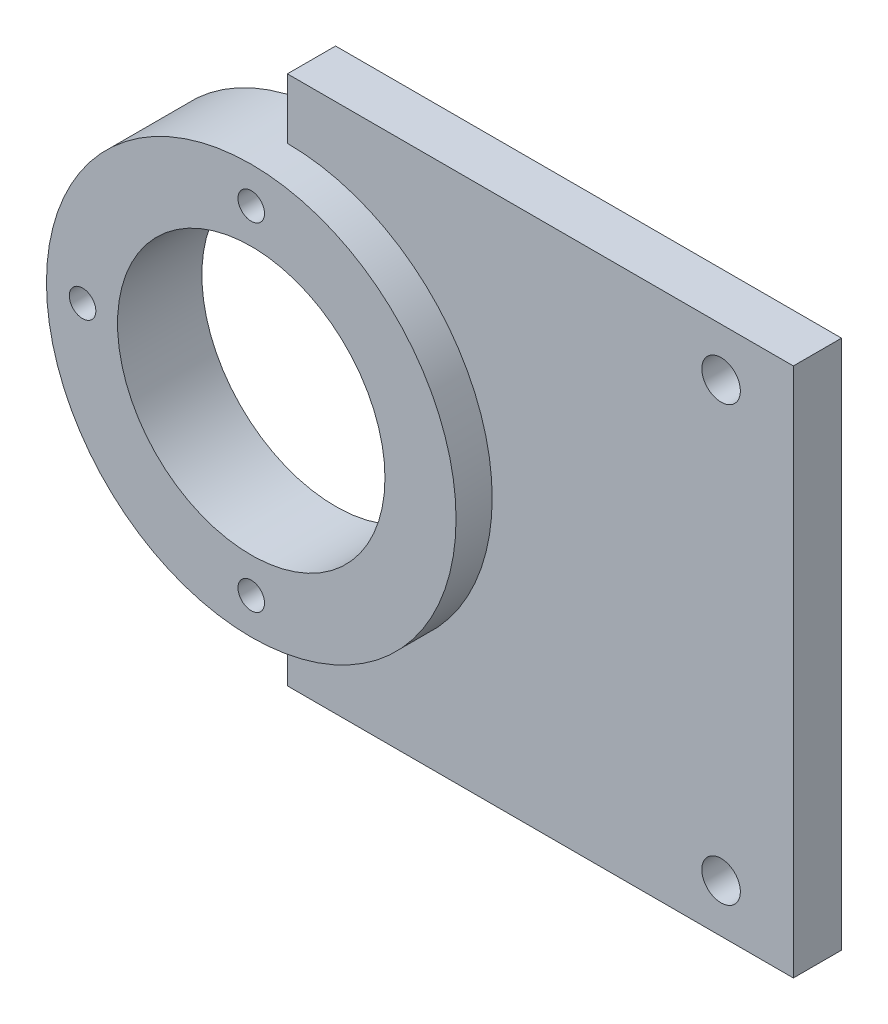
ISO-10303-21;
HEADER;
FILE_DESCRIPTION(('STEP AP214'),'2;1');
FILE_NAME('part.step','',(''),(''),'','','');
FILE_SCHEMA(('AUTOMOTIVE_DESIGN { 1 0 10303 214 1 1 1 1 }'));
ENDSEC;
DATA;
#1=APPLICATION_CONTEXT('core data for automotive mechanical design processes');
#2=APPLICATION_PROTOCOL_DEFINITION('international standard','automotive_design',2000,#1);
#3=PRODUCT_CONTEXT('',#1,'mechanical');
#4=PRODUCT('Part','Part','',(#3));
#5=PRODUCT_RELATED_PRODUCT_CATEGORY('part','',(#4));
#6=PRODUCT_DEFINITION_FORMATION('','',#4);
#7=PRODUCT_DEFINITION_CONTEXT('part definition',#1,'design');
#8=PRODUCT_DEFINITION('design','',#6,#7);
#9=PRODUCT_DEFINITION_SHAPE('','',#8);
#10=(LENGTH_UNIT() NAMED_UNIT(*) SI_UNIT(.MILLI.,.METRE.));
#11=(NAMED_UNIT(*) PLANE_ANGLE_UNIT() SI_UNIT($,.RADIAN.));
#12=(NAMED_UNIT(*) SI_UNIT($,.STERADIAN.) SOLID_ANGLE_UNIT());
#13=UNCERTAINTY_MEASURE_WITH_UNIT(LENGTH_MEASURE(1.E-05),#10,'distance_accuracy_value','');
#14=(GEOMETRIC_REPRESENTATION_CONTEXT(3) GLOBAL_UNCERTAINTY_ASSIGNED_CONTEXT((#13)) GLOBAL_UNIT_ASSIGNED_CONTEXT((#10,
#11,#12)) REPRESENTATION_CONTEXT('',''));
#15=CARTESIAN_POINT('',(0.,0.,0.));
#16=DIRECTION('',(0.,0.,1.));
#17=DIRECTION('',(1.,0.,0.));
#18=AXIS2_PLACEMENT_3D('',#15,#16,#17);
#19=CARTESIAN_POINT('',(0.,0.,7.));
#20=DIRECTION('',(0.,0.,-1.));
#21=DIRECTION('',(-1.,0.,0.));
#22=AXIS2_PLACEMENT_3D('',#19,#20,#21);
#23=CYLINDRICAL_SURFACE('',#22,17.);
#24=CARTESIAN_POINT('',(0.,0.,7.));
#25=DIRECTION('',(0.,0.,1.));
#26=DIRECTION('',(1.,0.,0.));
#27=AXIS2_PLACEMENT_3D('',#24,#25,#26);
#28=CIRCLE('',#27,17.);
#29=CARTESIAN_POINT('',(17.,0.,7.));
#30=VERTEX_POINT('',#29);
#31=EDGE_CURVE('E11',#30,#30,#28,.T.);
#32=ORIENTED_EDGE('',*,*,#31,.F.);
#33=EDGE_LOOP('',(#32));
#34=FACE_BOUND('',#33,.T.);
#35=DIRECTION('',(0.,0.,-1.));
#36=VECTOR('',#35,1.);
#37=CARTESIAN_POINT('',(0.,-17.,7.));
#38=LINE('',#37,#36);
#39=CARTESIAN_POINT('',(0.,-17.,4.));
#40=VERTEX_POINT('',#39);
#41=CARTESIAN_POINT('',(0.,-17.,0.));
#42=VERTEX_POINT('',#41);
#43=EDGE_CURVE('E133',#40,#42,#38,.T.);
#44=ORIENTED_EDGE('',*,*,#43,.F.);
#45=CARTESIAN_POINT('',(0.,0.,4.));
#46=DIRECTION('',(0.,0.,-1.));
#47=DIRECTION('',(-1.,0.,0.));
#48=AXIS2_PLACEMENT_3D('',#45,#46,#47);
#49=CIRCLE('',#48,17.);
#50=CARTESIAN_POINT('',(0.,17.,4.));
#51=VERTEX_POINT('',#50);
#52=EDGE_CURVE('E65',#51,#40,#49,.T.);
#53=ORIENTED_EDGE('',*,*,#52,.F.);
#54=DIRECTION('',(0.,0.,-1.));
#55=VECTOR('',#54,1.);
#56=CARTESIAN_POINT('',(0.,17.,7.));
#57=LINE('',#56,#55);
#58=CARTESIAN_POINT('',(0.,17.,0.));
#59=VERTEX_POINT('',#58);
#60=EDGE_CURVE('E130',#59,#51,#57,.F.);
#61=ORIENTED_EDGE('',*,*,#60,.F.);
#62=CARTESIAN_POINT('',(0.,0.,0.));
#63=DIRECTION('',(0.,0.,1.));
#64=DIRECTION('',(1.,0.,0.));
#65=AXIS2_PLACEMENT_3D('',#62,#63,#64);
#66=CIRCLE('',#65,17.);
#67=EDGE_CURVE('E53',#59,#42,#66,.T.);
#68=ORIENTED_EDGE('',*,*,#67,.T.);
#69=EDGE_LOOP('',(#44,#53,#61,#68));
#70=FACE_BOUND('',#69,.T.);
#71=ADVANCED_FACE('F44',(#34,#70),#23,.T.);
#72=CARTESIAN_POINT('',(0.,0.,7.));
#73=DIRECTION('',(0.,0.,-1.));
#74=DIRECTION('',(-1.,0.,0.));
#75=AXIS2_PLACEMENT_3D('',#72,#73,#74);
#76=CYLINDRICAL_SURFACE('',#75,11.1);
#77=CARTESIAN_POINT('',(0.,0.,0.));
#78=DIRECTION('',(0.,0.,1.));
#79=DIRECTION('',(1.,0.,0.));
#80=AXIS2_PLACEMENT_3D('',#77,#78,#79);
#81=CIRCLE('',#80,11.1);
#82=CARTESIAN_POINT('',(11.1,0.,0.));
#83=VERTEX_POINT('',#82);
#84=EDGE_CURVE('E138',#83,#83,#81,.T.);
#85=ORIENTED_EDGE('',*,*,#84,.F.);
#86=EDGE_LOOP('',(#85));
#87=FACE_BOUND('',#86,.T.);
#88=CARTESIAN_POINT('',(0.,0.,7.));
#89=DIRECTION('',(0.,0.,1.));
#90=DIRECTION('',(1.,0.,0.));
#91=AXIS2_PLACEMENT_3D('',#88,#89,#90);
#92=CIRCLE('',#91,11.1);
#93=CARTESIAN_POINT('',(11.1,0.,7.));
#94=VERTEX_POINT('',#93);
#95=EDGE_CURVE('E139',#94,#94,#92,.T.);
#96=ORIENTED_EDGE('',*,*,#95,.T.);
#97=EDGE_LOOP('',(#96));
#98=FACE_BOUND('',#97,.T.);
#99=ADVANCED_FACE('F247',(#87,#98),#76,.F.);
#100=CARTESIAN_POINT('',(0.,0.,7.));
#101=DIRECTION('',(0.,0.,1.));
#102=DIRECTION('',(1.,0.,0.));
#103=AXIS2_PLACEMENT_3D('',#100,#101,#102);
#104=PLANE('',#103);
#105=CARTESIAN_POINT('',(-14.,0.,7.));
#106=DIRECTION('',(0.,0.,1.));
#107=DIRECTION('',(1.,0.,0.));
#108=AXIS2_PLACEMENT_3D('',#105,#106,#107);
#109=CIRCLE('',#108,1.1);
#110=CARTESIAN_POINT('',(-15.1,0.,7.));
#111=VERTEX_POINT('',#110);
#112=EDGE_CURVE('E165',#111,#111,#109,.T.);
#113=ORIENTED_EDGE('',*,*,#112,.F.);
#114=EDGE_LOOP('',(#113));
#115=FACE_BOUND('',#114,.T.);
#116=CARTESIAN_POINT('',(0.,-14.,7.));
#117=DIRECTION('',(0.,0.,1.));
#118=DIRECTION('',(1.,0.,0.));
#119=AXIS2_PLACEMENT_3D('',#116,#117,#118);
#120=CIRCLE('',#119,1.1);
#121=CARTESIAN_POINT('',(-1.1,-14.,7.));
#122=VERTEX_POINT('',#121);
#123=EDGE_CURVE('E231',#122,#122,#120,.T.);
#124=ORIENTED_EDGE('',*,*,#123,.F.);
#125=EDGE_LOOP('',(#124));
#126=FACE_BOUND('',#125,.T.);
#127=CARTESIAN_POINT('',(0.,14.,7.));
#128=DIRECTION('',(0.,0.,1.));
#129=DIRECTION('',(1.,0.,0.));
#130=AXIS2_PLACEMENT_3D('',#127,#128,#129);
#131=CIRCLE('',#130,1.1);
#132=CARTESIAN_POINT('',(-1.1,14.,7.));
#133=VERTEX_POINT('',#132);
#134=EDGE_CURVE('E232',#133,#133,#131,.T.);
#135=ORIENTED_EDGE('',*,*,#134,.F.);
#136=EDGE_LOOP('',(#135));
#137=FACE_BOUND('',#136,.T.);
#138=ORIENTED_EDGE('',*,*,#31,.T.);
#139=EDGE_LOOP('',(#138));
#140=FACE_BOUND('',#139,.T.);
#141=ORIENTED_EDGE('',*,*,#95,.F.);
#142=EDGE_LOOP('',(#141));
#143=FACE_BOUND('',#142,.T.);
#144=ADVANCED_FACE('F177',(#115,#126,#137,#140,#143),#104,.T.);
#145=CARTESIAN_POINT('',(0.,0.,0.));
#146=DIRECTION('',(0.,0.,1.));
#147=DIRECTION('',(1.,0.,0.));
#148=AXIS2_PLACEMENT_3D('',#145,#146,#147);
#149=PLANE('',#148);
#150=CARTESIAN_POINT('',(-14.,0.,0.));
#151=DIRECTION('',(0.,0.,1.));
#152=DIRECTION('',(1.,0.,0.));
#153=AXIS2_PLACEMENT_3D('',#150,#151,#152);
#154=CIRCLE('',#153,1.1);
#155=CARTESIAN_POINT('',(-15.1,0.,0.));
#156=VERTEX_POINT('',#155);
#157=EDGE_CURVE('E48',#156,#156,#154,.F.);
#158=ORIENTED_EDGE('',*,*,#157,.F.);
#159=EDGE_LOOP('',(#158));
#160=FACE_BOUND('',#159,.T.);
#161=CARTESIAN_POINT('',(0.,-14.,0.));
#162=DIRECTION('',(0.,0.,1.));
#163=DIRECTION('',(1.,0.,0.));
#164=AXIS2_PLACEMENT_3D('',#161,#162,#163);
#165=CIRCLE('',#164,1.1);
#166=CARTESIAN_POINT('',(-1.1,-14.,0.));
#167=VERTEX_POINT('',#166);
#168=EDGE_CURVE('E161',#167,#167,#165,.F.);
#169=ORIENTED_EDGE('',*,*,#168,.F.);
#170=EDGE_LOOP('',(#169));
#171=FACE_BOUND('',#170,.T.);
#172=CARTESIAN_POINT('',(0.,14.,0.));
#173=DIRECTION('',(0.,0.,1.));
#174=DIRECTION('',(1.,0.,0.));
#175=AXIS2_PLACEMENT_3D('',#172,#173,#174);
#176=CIRCLE('',#175,1.1);
#177=CARTESIAN_POINT('',(-1.1,14.,0.));
#178=VERTEX_POINT('',#177);
#179=EDGE_CURVE('E158',#178,#178,#176,.F.);
#180=ORIENTED_EDGE('',*,*,#179,.F.);
#181=EDGE_LOOP('',(#180));
#182=FACE_BOUND('',#181,.T.);
#183=CARTESIAN_POINT('',(36.,-18.,0.));
#184=DIRECTION('',(0.,0.,1.));
#185=DIRECTION('',(1.,0.,0.));
#186=AXIS2_PLACEMENT_3D('',#183,#184,#185);
#187=CIRCLE('',#186,1.6);
#188=CARTESIAN_POINT('',(34.4,-18.,0.));
#189=VERTEX_POINT('',#188);
#190=EDGE_CURVE('E160',#189,#189,#187,.F.);
#191=ORIENTED_EDGE('',*,*,#190,.F.);
#192=EDGE_LOOP('',(#191));
#193=FACE_BOUND('',#192,.T.);
#194=CARTESIAN_POINT('',(36.,18.,0.));
#195=DIRECTION('',(0.,0.,1.));
#196=DIRECTION('',(1.,0.,0.));
#197=AXIS2_PLACEMENT_3D('',#194,#195,#196);
#198=CIRCLE('',#197,1.6);
#199=CARTESIAN_POINT('',(34.4,18.,0.));
#200=VERTEX_POINT('',#199);
#201=EDGE_CURVE('E155',#200,#200,#198,.F.);
#202=ORIENTED_EDGE('',*,*,#201,.F.);
#203=EDGE_LOOP('',(#202));
#204=FACE_BOUND('',#203,.T.);
#205=ORIENTED_EDGE('',*,*,#84,.T.);
#206=EDGE_LOOP('',(#205));
#207=FACE_BOUND('',#206,.T.);
#208=ORIENTED_EDGE('',*,*,#67,.F.);
#209=DIRECTION('',(0.,-1.,0.));
#210=VECTOR('',#209,1.);
#211=CARTESIAN_POINT('',(0.,-22.,0.));
#212=LINE('',#211,#210);
#213=CARTESIAN_POINT('',(0.,22.,0.));
#214=VERTEX_POINT('',#213);
#215=EDGE_CURVE('E192',#214,#59,#212,.T.);
#216=ORIENTED_EDGE('',*,*,#215,.F.);
#217=DIRECTION('',(-1.,0.,0.));
#218=VECTOR('',#217,1.);
#219=CARTESIAN_POINT('',(0.,22.,0.));
#220=LINE('',#219,#218);
#221=CARTESIAN_POINT('',(42.,22.,0.));
#222=VERTEX_POINT('',#221);
#223=EDGE_CURVE('E110',#222,#214,#220,.T.);
#224=ORIENTED_EDGE('',*,*,#223,.F.);
#225=DIRECTION('',(0.,1.,0.));
#226=VECTOR('',#225,1.);
#227=CARTESIAN_POINT('',(42.,-22.,0.));
#228=LINE('',#227,#226);
#229=CARTESIAN_POINT('',(42.,-22.,0.));
#230=VERTEX_POINT('',#229);
#231=EDGE_CURVE('E201',#230,#222,#228,.T.);
#232=ORIENTED_EDGE('',*,*,#231,.F.);
#233=DIRECTION('',(1.,0.,0.));
#234=VECTOR('',#233,1.);
#235=CARTESIAN_POINT('',(0.,-22.,0.));
#236=LINE('',#235,#234);
#237=CARTESIAN_POINT('',(0.,-22.,0.));
#238=VERTEX_POINT('',#237);
#239=EDGE_CURVE('E200',#238,#230,#236,.T.);
#240=ORIENTED_EDGE('',*,*,#239,.F.);
#241=EDGE_CURVE('E122',#42,#238,#212,.T.);
#242=ORIENTED_EDGE('',*,*,#241,.F.);
#243=EDGE_LOOP('',(#208,#216,#224,#232,#240,#242));
#244=FACE_BOUND('',#243,.T.);
#245=ADVANCED_FACE('F174',(#160,#171,#182,#193,#204,#207,#244),#149,.F.);
#246=CARTESIAN_POINT('',(0.,-22.,4.));
#247=DIRECTION('',(1.,0.,0.));
#248=DIRECTION('',(0.,0.,-1.));
#249=AXIS2_PLACEMENT_3D('',#246,#247,#248);
#250=PLANE('',#249);
#251=DIRECTION('',(0.,-1.,0.));
#252=VECTOR('',#251,1.);
#253=CARTESIAN_POINT('',(0.,-22.,4.));
#254=LINE('',#253,#252);
#255=CARTESIAN_POINT('',(0.,-22.,4.));
#256=VERTEX_POINT('',#255);
#257=EDGE_CURVE('E100',#40,#256,#254,.T.);
#258=ORIENTED_EDGE('',*,*,#257,.F.);
#259=ORIENTED_EDGE('',*,*,#43,.T.);
#260=ORIENTED_EDGE('',*,*,#241,.T.);
#261=DIRECTION('',(0.,0.,-1.));
#262=VECTOR('',#261,1.);
#263=CARTESIAN_POINT('',(0.,-22.,4.));
#264=LINE('',#263,#262);
#265=EDGE_CURVE('E115',#256,#238,#264,.T.);
#266=ORIENTED_EDGE('',*,*,#265,.F.);
#267=EDGE_LOOP('',(#258,#259,#260,#266));
#268=FACE_BOUND('',#267,.T.);
#269=ADVANCED_FACE('F116',(#268),#250,.F.);
#270=ORIENTED_EDGE('',*,*,#215,.T.);
#271=ORIENTED_EDGE('',*,*,#60,.T.);
#272=CARTESIAN_POINT('',(0.,22.,4.));
#273=VERTEX_POINT('',#272);
#274=EDGE_CURVE('E106',#273,#51,#254,.T.);
#275=ORIENTED_EDGE('',*,*,#274,.F.);
#276=DIRECTION('',(0.,0.,-1.));
#277=VECTOR('',#276,1.);
#278=CARTESIAN_POINT('',(0.,22.,4.));
#279=LINE('',#278,#277);
#280=EDGE_CURVE('E197',#273,#214,#279,.T.);
#281=ORIENTED_EDGE('',*,*,#280,.T.);
#282=EDGE_LOOP('',(#270,#271,#275,#281));
#283=FACE_BOUND('',#282,.T.);
#284=ADVANCED_FACE('F194',(#283),#250,.F.);
#285=CARTESIAN_POINT('',(0.,-22.,4.));
#286=DIRECTION('',(0.,1.,0.));
#287=DIRECTION('',(0.,0.,1.));
#288=AXIS2_PLACEMENT_3D('',#285,#286,#287);
#289=PLANE('',#288);
#290=ORIENTED_EDGE('',*,*,#239,.T.);
#291=DIRECTION('',(0.,0.,-1.));
#292=VECTOR('',#291,1.);
#293=CARTESIAN_POINT('',(42.,-22.,4.));
#294=LINE('',#293,#292);
#295=CARTESIAN_POINT('',(42.,-22.,4.));
#296=VERTEX_POINT('',#295);
#297=EDGE_CURVE('E111',#296,#230,#294,.T.);
#298=ORIENTED_EDGE('',*,*,#297,.F.);
#299=DIRECTION('',(1.,0.,0.));
#300=VECTOR('',#299,1.);
#301=CARTESIAN_POINT('',(0.,-22.,4.));
#302=LINE('',#301,#300);
#303=EDGE_CURVE('E101',#256,#296,#302,.T.);
#304=ORIENTED_EDGE('',*,*,#303,.F.);
#305=ORIENTED_EDGE('',*,*,#265,.T.);
#306=EDGE_LOOP('',(#290,#298,#304,#305));
#307=FACE_BOUND('',#306,.T.);
#308=ADVANCED_FACE('F112',(#307),#289,.F.);
#309=CARTESIAN_POINT('',(42.,-22.,4.));
#310=DIRECTION('',(-1.,0.,0.));
#311=DIRECTION('',(0.,0.,1.));
#312=AXIS2_PLACEMENT_3D('',#309,#310,#311);
#313=PLANE('',#312);
#314=ORIENTED_EDGE('',*,*,#231,.T.);
#315=DIRECTION('',(0.,0.,-1.));
#316=VECTOR('',#315,1.);
#317=CARTESIAN_POINT('',(42.,22.,4.));
#318=LINE('',#317,#316);
#319=CARTESIAN_POINT('',(42.,22.,4.));
#320=VERTEX_POINT('',#319);
#321=EDGE_CURVE('E129',#320,#222,#318,.T.);
#322=ORIENTED_EDGE('',*,*,#321,.F.);
#323=DIRECTION('',(0.,1.,0.));
#324=VECTOR('',#323,1.);
#325=CARTESIAN_POINT('',(42.,-22.,4.));
#326=LINE('',#325,#324);
#327=EDGE_CURVE('E120',#296,#320,#326,.T.);
#328=ORIENTED_EDGE('',*,*,#327,.F.);
#329=ORIENTED_EDGE('',*,*,#297,.T.);
#330=EDGE_LOOP('',(#314,#322,#328,#329));
#331=FACE_BOUND('',#330,.T.);
#332=ADVANCED_FACE('F225',(#331),#313,.F.);
#333=CARTESIAN_POINT('',(0.,22.,4.));
#334=DIRECTION('',(0.,-1.,0.));
#335=DIRECTION('',(0.,0.,-1.));
#336=AXIS2_PLACEMENT_3D('',#333,#334,#335);
#337=PLANE('',#336);
#338=ORIENTED_EDGE('',*,*,#223,.T.);
#339=ORIENTED_EDGE('',*,*,#280,.F.);
#340=DIRECTION('',(-1.,0.,0.));
#341=VECTOR('',#340,1.);
#342=CARTESIAN_POINT('',(0.,22.,4.));
#343=LINE('',#342,#341);
#344=EDGE_CURVE('E206',#320,#273,#343,.T.);
#345=ORIENTED_EDGE('',*,*,#344,.F.);
#346=ORIENTED_EDGE('',*,*,#321,.T.);
#347=EDGE_LOOP('',(#338,#339,#345,#346));
#348=FACE_BOUND('',#347,.T.);
#349=ADVANCED_FACE('F218',(#348),#337,.F.);
#350=CARTESIAN_POINT('',(0.,0.,4.));
#351=DIRECTION('',(0.,0.,-1.));
#352=DIRECTION('',(-1.,0.,0.));
#353=AXIS2_PLACEMENT_3D('',#350,#351,#352);
#354=PLANE('',#353);
#355=CARTESIAN_POINT('',(36.,-18.,4.));
#356=DIRECTION('',(0.,0.,-1.));
#357=DIRECTION('',(-1.,0.,0.));
#358=AXIS2_PLACEMENT_3D('',#355,#356,#357);
#359=CIRCLE('',#358,1.6);
#360=CARTESIAN_POINT('',(34.4,-18.,4.));
#361=VERTEX_POINT('',#360);
#362=EDGE_CURVE('E153',#361,#361,#359,.F.);
#363=ORIENTED_EDGE('',*,*,#362,.F.);
#364=EDGE_LOOP('',(#363));
#365=FACE_BOUND('',#364,.T.);
#366=CARTESIAN_POINT('',(36.,18.,4.));
#367=DIRECTION('',(0.,0.,-1.));
#368=DIRECTION('',(-1.,0.,0.));
#369=AXIS2_PLACEMENT_3D('',#366,#367,#368);
#370=CIRCLE('',#369,1.6);
#371=CARTESIAN_POINT('',(34.4,18.,4.));
#372=VERTEX_POINT('',#371);
#373=EDGE_CURVE('E146',#372,#372,#370,.F.);
#374=ORIENTED_EDGE('',*,*,#373,.F.);
#375=EDGE_LOOP('',(#374));
#376=FACE_BOUND('',#375,.T.);
#377=ORIENTED_EDGE('',*,*,#274,.T.);
#378=ORIENTED_EDGE('',*,*,#52,.T.);
#379=ORIENTED_EDGE('',*,*,#257,.T.);
#380=ORIENTED_EDGE('',*,*,#303,.T.);
#381=ORIENTED_EDGE('',*,*,#327,.T.);
#382=ORIENTED_EDGE('',*,*,#344,.T.);
#383=EDGE_LOOP('',(#377,#378,#379,#380,#381,#382));
#384=FACE_BOUND('',#383,.T.);
#385=ADVANCED_FACE('F99',(#365,#376,#384),#354,.F.);
#386=CARTESIAN_POINT('',(36.,18.,7.));
#387=DIRECTION('',(0.,0.,-1.));
#388=DIRECTION('',(-1.,0.,0.));
#389=AXIS2_PLACEMENT_3D('',#386,#387,#388);
#390=CYLINDRICAL_SURFACE('',#389,1.6);
#391=CARTESIAN_POINT('',(34.4,18.,4.));
#392=CARTESIAN_POINT('',(34.4,18.,3.95833333333333));
#393=CARTESIAN_POINT('',(34.4,18.,3.91666666666667));
#394=CARTESIAN_POINT('',(34.4,18.,3.83333333333333));
#395=CARTESIAN_POINT('',(34.4,18.,3.79166666666667));
#396=CARTESIAN_POINT('',(34.4,18.,3.70833333333333));
#397=CARTESIAN_POINT('',(34.4,18.,3.66666666666667));
#398=CARTESIAN_POINT('',(34.4,18.,3.58333333333333));
#399=CARTESIAN_POINT('',(34.4,18.,3.54166666666667));
#400=CARTESIAN_POINT('',(34.4,18.,3.45833333333333));
#401=CARTESIAN_POINT('',(34.4,18.,3.41666666666667));
#402=CARTESIAN_POINT('',(34.4,18.,3.33333333333333));
#403=CARTESIAN_POINT('',(34.4,18.,3.29166666666667));
#404=CARTESIAN_POINT('',(34.4,18.,3.20833333333333));
#405=CARTESIAN_POINT('',(34.4,18.,3.16666666666667));
#406=CARTESIAN_POINT('',(34.4,18.,3.08333333333333));
#407=CARTESIAN_POINT('',(34.4,18.,3.04166666666667));
#408=CARTESIAN_POINT('',(34.4,18.,2.95833333333333));
#409=CARTESIAN_POINT('',(34.4,18.,2.91666666666667));
#410=CARTESIAN_POINT('',(34.4,18.,2.83333333333333));
#411=CARTESIAN_POINT('',(34.4,18.,2.79166666666667));
#412=CARTESIAN_POINT('',(34.4,18.,2.70833333333333));
#413=CARTESIAN_POINT('',(34.4,18.,2.66666666666667));
#414=CARTESIAN_POINT('',(34.4,18.,2.58333333333333));
#415=CARTESIAN_POINT('',(34.4,18.,2.54166666666667));
#416=CARTESIAN_POINT('',(34.4,18.,2.45833333333333));
#417=CARTESIAN_POINT('',(34.4,18.,2.41666666666667));
#418=CARTESIAN_POINT('',(34.4,18.,2.33333333333333));
#419=CARTESIAN_POINT('',(34.4,18.,2.29166666666667));
#420=CARTESIAN_POINT('',(34.4,18.,2.20833333333333));
#421=CARTESIAN_POINT('',(34.4,18.,2.16666666666667));
#422=CARTESIAN_POINT('',(34.4,18.,2.08333333333333));
#423=CARTESIAN_POINT('',(34.4,18.,2.04166666666667));
#424=CARTESIAN_POINT('',(34.4,18.,1.95833333333333));
#425=CARTESIAN_POINT('',(34.4,18.,1.91666666666667));
#426=CARTESIAN_POINT('',(34.4,18.,1.83333333333333));
#427=CARTESIAN_POINT('',(34.4,18.,1.79166666666667));
#428=CARTESIAN_POINT('',(34.4,18.,1.70833333333333));
#429=CARTESIAN_POINT('',(34.4,18.,1.66666666666667));
#430=CARTESIAN_POINT('',(34.4,18.,1.58333333333333));
#431=CARTESIAN_POINT('',(34.4,18.,1.54166666666667));
#432=CARTESIAN_POINT('',(34.4,18.,1.45833333333333));
#433=CARTESIAN_POINT('',(34.4,18.,1.41666666666667));
#434=CARTESIAN_POINT('',(34.4,18.,1.33333333333333));
#435=CARTESIAN_POINT('',(34.4,18.,1.29166666666667));
#436=CARTESIAN_POINT('',(34.4,18.,1.20833333333333));
#437=CARTESIAN_POINT('',(34.4,18.,1.16666666666667));
#438=CARTESIAN_POINT('',(34.4,18.,1.08333333333333));
#439=CARTESIAN_POINT('',(34.4,18.,1.04166666666667));
#440=CARTESIAN_POINT('',(34.4,18.,0.958333333333333));
#441=CARTESIAN_POINT('',(34.4,18.,0.916666666666667));
#442=CARTESIAN_POINT('',(34.4,18.,0.833333333333333));
#443=CARTESIAN_POINT('',(34.4,18.,0.791666666666667));
#444=CARTESIAN_POINT('',(34.4,18.,0.708333333333333));
#445=CARTESIAN_POINT('',(34.4,18.,0.666666666666666));
#446=CARTESIAN_POINT('',(34.4,18.,0.583333333333333));
#447=CARTESIAN_POINT('',(34.4,18.,0.541666666666666));
#448=CARTESIAN_POINT('',(34.4,18.,0.458333333333333));
#449=CARTESIAN_POINT('',(34.4,18.,0.416666666666666));
#450=CARTESIAN_POINT('',(34.4,18.,0.333333333333333));
#451=CARTESIAN_POINT('',(34.4,18.,0.291666666666666));
#452=CARTESIAN_POINT('',(34.4,18.,0.208333333333333));
#453=CARTESIAN_POINT('',(34.4,18.,0.166666666666666));
#454=CARTESIAN_POINT('',(34.4,18.,0.0833333333333325));
#455=CARTESIAN_POINT('',(34.4,18.,0.0416666666666658));
#456=CARTESIAN_POINT('',(34.4,18.,0.));
#457=B_SPLINE_CURVE_WITH_KNOTS('',3,(#391,#392,#393,#394,#395,#396,#397,#398,#399,#400,#401,
#402,#403,#404,#405,#406,#407,#408,#409,#410,#411,#412,#413,#414,#415,#416,#417,#418,#419,#420,
#421,#422,#423,#424,#425,#426,#427,#428,#429,#430,#431,#432,#433,#434,#435,#436,#437,#438,#439,
#440,#441,#442,#443,#444,#445,#446,#447,#448,#449,#450,#451,#452,#453,#454,#455,#456),
.UNSPECIFIED.,.F.,.F.,(4,2,2,2,2,2,2,2,2,2,2,2,2,2,2,2,2,2,2,2,2,2,2,2,2,2,2,2,2,2,2,2,4),(0.,
0.125,0.25,0.375,0.5,0.625,0.75,0.875,1.,1.125,1.25,1.375,1.5,1.625,1.75,1.875,2.,2.125,2.25,
2.375,2.5,2.625,2.75,2.875,3.,3.125,3.25,3.375,3.5,3.625,3.75,3.875,4.),.UNSPECIFIED.);
#458=EDGE_CURVE('BSEAM273',#372,#200,#457,.T.);
#459=ORIENTED_EDGE('',*,*,#373,.T.);
#460=ORIENTED_EDGE('',*,*,#201,.T.);
#461=ORIENTED_EDGE('',*,*,#458,.T.);
#462=ORIENTED_EDGE('',*,*,#458,.F.);
#463=EDGE_LOOP('',(#459,#461,#460,#462));
#464=FACE_BOUND('',#463,.T.);
#465=ADVANCED_FACE('F273',(#464),#390,.F.);
#466=CARTESIAN_POINT('',(36.,-18.,7.));
#467=DIRECTION('',(0.,0.,-1.));
#468=DIRECTION('',(-1.,0.,0.));
#469=AXIS2_PLACEMENT_3D('',#466,#467,#468);
#470=CYLINDRICAL_SURFACE('',#469,1.6);
#471=CARTESIAN_POINT('',(34.4,-18.,4.));
#472=CARTESIAN_POINT('',(34.4,-18.,3.95833333333333));
#473=CARTESIAN_POINT('',(34.4,-18.,3.91666666666667));
#474=CARTESIAN_POINT('',(34.4,-18.,3.83333333333333));
#475=CARTESIAN_POINT('',(34.4,-18.,3.79166666666667));
#476=CARTESIAN_POINT('',(34.4,-18.,3.70833333333333));
#477=CARTESIAN_POINT('',(34.4,-18.,3.66666666666667));
#478=CARTESIAN_POINT('',(34.4,-18.,3.58333333333333));
#479=CARTESIAN_POINT('',(34.4,-18.,3.54166666666667));
#480=CARTESIAN_POINT('',(34.4,-18.,3.45833333333333));
#481=CARTESIAN_POINT('',(34.4,-18.,3.41666666666667));
#482=CARTESIAN_POINT('',(34.4,-18.,3.33333333333333));
#483=CARTESIAN_POINT('',(34.4,-18.,3.29166666666667));
#484=CARTESIAN_POINT('',(34.4,-18.,3.20833333333333));
#485=CARTESIAN_POINT('',(34.4,-18.,3.16666666666667));
#486=CARTESIAN_POINT('',(34.4,-18.,3.08333333333333));
#487=CARTESIAN_POINT('',(34.4,-18.,3.04166666666667));
#488=CARTESIAN_POINT('',(34.4,-18.,2.95833333333333));
#489=CARTESIAN_POINT('',(34.4,-18.,2.91666666666667));
#490=CARTESIAN_POINT('',(34.4,-18.,2.83333333333333));
#491=CARTESIAN_POINT('',(34.4,-18.,2.79166666666667));
#492=CARTESIAN_POINT('',(34.4,-18.,2.70833333333333));
#493=CARTESIAN_POINT('',(34.4,-18.,2.66666666666667));
#494=CARTESIAN_POINT('',(34.4,-18.,2.58333333333333));
#495=CARTESIAN_POINT('',(34.4,-18.,2.54166666666667));
#496=CARTESIAN_POINT('',(34.4,-18.,2.45833333333333));
#497=CARTESIAN_POINT('',(34.4,-18.,2.41666666666667));
#498=CARTESIAN_POINT('',(34.4,-18.,2.33333333333333));
#499=CARTESIAN_POINT('',(34.4,-18.,2.29166666666667));
#500=CARTESIAN_POINT('',(34.4,-18.,2.20833333333333));
#501=CARTESIAN_POINT('',(34.4,-18.,2.16666666666667));
#502=CARTESIAN_POINT('',(34.4,-18.,2.08333333333333));
#503=CARTESIAN_POINT('',(34.4,-18.,2.04166666666667));
#504=CARTESIAN_POINT('',(34.4,-18.,1.95833333333333));
#505=CARTESIAN_POINT('',(34.4,-18.,1.91666666666667));
#506=CARTESIAN_POINT('',(34.4,-18.,1.83333333333333));
#507=CARTESIAN_POINT('',(34.4,-18.,1.79166666666667));
#508=CARTESIAN_POINT('',(34.4,-18.,1.70833333333333));
#509=CARTESIAN_POINT('',(34.4,-18.,1.66666666666667));
#510=CARTESIAN_POINT('',(34.4,-18.,1.58333333333333));
#511=CARTESIAN_POINT('',(34.4,-18.,1.54166666666667));
#512=CARTESIAN_POINT('',(34.4,-18.,1.45833333333333));
#513=CARTESIAN_POINT('',(34.4,-18.,1.41666666666667));
#514=CARTESIAN_POINT('',(34.4,-18.,1.33333333333333));
#515=CARTESIAN_POINT('',(34.4,-18.,1.29166666666667));
#516=CARTESIAN_POINT('',(34.4,-18.,1.20833333333333));
#517=CARTESIAN_POINT('',(34.4,-18.,1.16666666666667));
#518=CARTESIAN_POINT('',(34.4,-18.,1.08333333333333));
#519=CARTESIAN_POINT('',(34.4,-18.,1.04166666666667));
#520=CARTESIAN_POINT('',(34.4,-18.,0.958333333333333));
#521=CARTESIAN_POINT('',(34.4,-18.,0.916666666666667));
#522=CARTESIAN_POINT('',(34.4,-18.,0.833333333333333));
#523=CARTESIAN_POINT('',(34.4,-18.,0.791666666666667));
#524=CARTESIAN_POINT('',(34.4,-18.,0.708333333333333));
#525=CARTESIAN_POINT('',(34.4,-18.,0.666666666666666));
#526=CARTESIAN_POINT('',(34.4,-18.,0.583333333333333));
#527=CARTESIAN_POINT('',(34.4,-18.,0.541666666666666));
#528=CARTESIAN_POINT('',(34.4,-18.,0.458333333333333));
#529=CARTESIAN_POINT('',(34.4,-18.,0.416666666666666));
#530=CARTESIAN_POINT('',(34.4,-18.,0.333333333333333));
#531=CARTESIAN_POINT('',(34.4,-18.,0.291666666666666));
#532=CARTESIAN_POINT('',(34.4,-18.,0.208333333333333));
#533=CARTESIAN_POINT('',(34.4,-18.,0.166666666666666));
#534=CARTESIAN_POINT('',(34.4,-18.,0.0833333333333325));
#535=CARTESIAN_POINT('',(34.4,-18.,0.0416666666666658));
#536=CARTESIAN_POINT('',(34.4,-18.,0.));
#537=B_SPLINE_CURVE_WITH_KNOTS('',3,(#471,#472,#473,#474,#475,#476,#477,#478,#479,#480,#481,
#482,#483,#484,#485,#486,#487,#488,#489,#490,#491,#492,#493,#494,#495,#496,#497,#498,#499,#500,
#501,#502,#503,#504,#505,#506,#507,#508,#509,#510,#511,#512,#513,#514,#515,#516,#517,#518,#519,
#520,#521,#522,#523,#524,#525,#526,#527,#528,#529,#530,#531,#532,#533,#534,#535,#536),
.UNSPECIFIED.,.F.,.F.,(4,2,2,2,2,2,2,2,2,2,2,2,2,2,2,2,2,2,2,2,2,2,2,2,2,2,2,2,2,2,2,2,4),(0.,
0.125,0.25,0.375,0.5,0.625,0.75,0.875,1.,1.125,1.25,1.375,1.5,1.625,1.75,1.875,2.,2.125,2.25,
2.375,2.5,2.625,2.75,2.875,3.,3.125,3.25,3.375,3.5,3.625,3.75,3.875,4.),.UNSPECIFIED.);
#538=EDGE_CURVE('BSEAM279',#361,#189,#537,.T.);
#539=ORIENTED_EDGE('',*,*,#362,.T.);
#540=ORIENTED_EDGE('',*,*,#190,.T.);
#541=ORIENTED_EDGE('',*,*,#538,.T.);
#542=ORIENTED_EDGE('',*,*,#538,.F.);
#543=EDGE_LOOP('',(#539,#541,#540,#542));
#544=FACE_BOUND('',#543,.T.);
#545=ADVANCED_FACE('F279',(#544),#470,.F.);
#546=CARTESIAN_POINT('',(0.,14.,7.));
#547=DIRECTION('',(0.,0.,-1.));
#548=DIRECTION('',(-1.,0.,0.));
#549=AXIS2_PLACEMENT_3D('',#546,#547,#548);
#550=CYLINDRICAL_SURFACE('',#549,1.1);
#551=CARTESIAN_POINT('',(-1.1,14.,7.));
#552=CARTESIAN_POINT('',(-1.1,14.,6.92708333333333));
#553=CARTESIAN_POINT('',(-1.1,14.,6.85416666666667));
#554=CARTESIAN_POINT('',(-1.1,14.,6.70833333333333));
#555=CARTESIAN_POINT('',(-1.1,14.,6.63541666666667));
#556=CARTESIAN_POINT('',(-1.1,14.,6.48958333333333));
#557=CARTESIAN_POINT('',(-1.1,14.,6.41666666666667));
#558=CARTESIAN_POINT('',(-1.1,14.,6.27083333333333));
#559=CARTESIAN_POINT('',(-1.1,14.,6.19791666666667));
#560=CARTESIAN_POINT('',(-1.1,14.,6.05208333333333));
#561=CARTESIAN_POINT('',(-1.1,14.,5.97916666666667));
#562=CARTESIAN_POINT('',(-1.1,14.,5.83333333333333));
#563=CARTESIAN_POINT('',(-1.1,14.,5.76041666666667));
#564=CARTESIAN_POINT('',(-1.1,14.,5.61458333333333));
#565=CARTESIAN_POINT('',(-1.1,14.,5.54166666666667));
#566=CARTESIAN_POINT('',(-1.1,14.,5.39583333333333));
#567=CARTESIAN_POINT('',(-1.1,14.,5.32291666666667));
#568=CARTESIAN_POINT('',(-1.1,14.,5.17708333333333));
#569=CARTESIAN_POINT('',(-1.1,14.,5.10416666666667));
#570=CARTESIAN_POINT('',(-1.1,14.,4.95833333333333));
#571=CARTESIAN_POINT('',(-1.1,14.,4.88541666666667));
#572=CARTESIAN_POINT('',(-1.1,14.,4.73958333333333));
#573=CARTESIAN_POINT('',(-1.1,14.,4.66666666666667));
#574=CARTESIAN_POINT('',(-1.1,14.,4.52083333333333));
#575=CARTESIAN_POINT('',(-1.1,14.,4.44791666666667));
#576=CARTESIAN_POINT('',(-1.1,14.,4.30208333333333));
#577=CARTESIAN_POINT('',(-1.1,14.,4.22916666666667));
#578=CARTESIAN_POINT('',(-1.1,14.,4.08333333333333));
#579=CARTESIAN_POINT('',(-1.1,14.,4.01041666666667));
#580=CARTESIAN_POINT('',(-1.1,14.,3.86458333333333));
#581=CARTESIAN_POINT('',(-1.1,14.,3.79166666666667));
#582=CARTESIAN_POINT('',(-1.1,14.,3.64583333333333));
#583=CARTESIAN_POINT('',(-1.1,14.,3.57291666666667));
#584=CARTESIAN_POINT('',(-1.1,14.,3.42708333333333));
#585=CARTESIAN_POINT('',(-1.1,14.,3.35416666666667));
#586=CARTESIAN_POINT('',(-1.1,14.,3.20833333333333));
#587=CARTESIAN_POINT('',(-1.1,14.,3.13541666666667));
#588=CARTESIAN_POINT('',(-1.1,14.,2.98958333333333));
#589=CARTESIAN_POINT('',(-1.1,14.,2.91666666666667));
#590=CARTESIAN_POINT('',(-1.1,14.,2.77083333333333));
#591=CARTESIAN_POINT('',(-1.1,14.,2.69791666666667));
#592=CARTESIAN_POINT('',(-1.1,14.,2.55208333333333));
#593=CARTESIAN_POINT('',(-1.1,14.,2.47916666666667));
#594=CARTESIAN_POINT('',(-1.1,14.,2.33333333333333));
#595=CARTESIAN_POINT('',(-1.1,14.,2.26041666666667));
#596=CARTESIAN_POINT('',(-1.1,14.,2.11458333333333));
#597=CARTESIAN_POINT('',(-1.1,14.,2.04166666666667));
#598=CARTESIAN_POINT('',(-1.1,14.,1.89583333333333));
#599=CARTESIAN_POINT('',(-1.1,14.,1.82291666666667));
#600=CARTESIAN_POINT('',(-1.1,14.,1.67708333333333));
#601=CARTESIAN_POINT('',(-1.1,14.,1.60416666666667));
#602=CARTESIAN_POINT('',(-1.1,14.,1.45833333333333));
#603=CARTESIAN_POINT('',(-1.1,14.,1.38541666666667));
#604=CARTESIAN_POINT('',(-1.1,14.,1.23958333333333));
#605=CARTESIAN_POINT('',(-1.1,14.,1.16666666666667));
#606=CARTESIAN_POINT('',(-1.1,14.,1.02083333333333));
#607=CARTESIAN_POINT('',(-1.1,14.,0.947916666666666));
#608=CARTESIAN_POINT('',(-1.1,14.,0.802083333333332));
#609=CARTESIAN_POINT('',(-1.1,14.,0.729166666666666));
#610=CARTESIAN_POINT('',(-1.1,14.,0.583333333333332));
#611=CARTESIAN_POINT('',(-1.1,14.,0.510416666666666));
#612=CARTESIAN_POINT('',(-1.1,14.,0.364583333333333));
#613=CARTESIAN_POINT('',(-1.1,14.,0.291666666666666));
#614=CARTESIAN_POINT('',(-1.1,14.,0.145833333333333));
#615=CARTESIAN_POINT('',(-1.1,14.,0.0729166666666657));
#616=CARTESIAN_POINT('',(-1.1,14.,0.));
#617=B_SPLINE_CURVE_WITH_KNOTS('',3,(#551,#552,#553,#554,#555,#556,#557,#558,#559,#560,#561,
#562,#563,#564,#565,#566,#567,#568,#569,#570,#571,#572,#573,#574,#575,#576,#577,#578,#579,#580,
#581,#582,#583,#584,#585,#586,#587,#588,#589,#590,#591,#592,#593,#594,#595,#596,#597,#598,#599,
#600,#601,#602,#603,#604,#605,#606,#607,#608,#609,#610,#611,#612,#613,#614,#615,#616),
.UNSPECIFIED.,.F.,.F.,(4,2,2,2,2,2,2,2,2,2,2,2,2,2,2,2,2,2,2,2,2,2,2,2,2,2,2,2,2,2,2,2,4),(0.,
0.218749999999999,0.4375,0.65625,0.875,1.09375,1.3125,1.53125,1.75,1.96875,2.1875,2.40625,2.625,
2.84375,3.0625,3.28125,3.5,3.71875,3.9375,4.15625,4.375,4.59375,4.8125,5.03125,5.25,5.46875,
5.6875,5.90625,6.125,6.34375,6.5625,6.78125,7.),.UNSPECIFIED.);
#618=EDGE_CURVE('BSEAM285',#133,#178,#617,.T.);
#619=ORIENTED_EDGE('',*,*,#134,.T.);
#620=ORIENTED_EDGE('',*,*,#179,.T.);
#621=ORIENTED_EDGE('',*,*,#618,.T.);
#622=ORIENTED_EDGE('',*,*,#618,.F.);
#623=EDGE_LOOP('',(#619,#621,#620,#622));
#624=FACE_BOUND('',#623,.T.);
#625=ADVANCED_FACE('F285',(#624),#550,.F.);
#626=CARTESIAN_POINT('',(0.,-14.,7.));
#627=DIRECTION('',(0.,0.,-1.));
#628=DIRECTION('',(-1.,0.,0.));
#629=AXIS2_PLACEMENT_3D('',#626,#627,#628);
#630=CYLINDRICAL_SURFACE('',#629,1.1);
#631=CARTESIAN_POINT('',(-1.1,-14.,7.));
#632=CARTESIAN_POINT('',(-1.1,-14.,6.92708333333333));
#633=CARTESIAN_POINT('',(-1.1,-14.,6.85416666666667));
#634=CARTESIAN_POINT('',(-1.1,-14.,6.70833333333333));
#635=CARTESIAN_POINT('',(-1.1,-14.,6.63541666666667));
#636=CARTESIAN_POINT('',(-1.1,-14.,6.48958333333333));
#637=CARTESIAN_POINT('',(-1.1,-14.,6.41666666666667));
#638=CARTESIAN_POINT('',(-1.1,-14.,6.27083333333333));
#639=CARTESIAN_POINT('',(-1.1,-14.,6.19791666666667));
#640=CARTESIAN_POINT('',(-1.1,-14.,6.05208333333333));
#641=CARTESIAN_POINT('',(-1.1,-14.,5.97916666666667));
#642=CARTESIAN_POINT('',(-1.1,-14.,5.83333333333333));
#643=CARTESIAN_POINT('',(-1.1,-14.,5.76041666666667));
#644=CARTESIAN_POINT('',(-1.1,-14.,5.61458333333333));
#645=CARTESIAN_POINT('',(-1.1,-14.,5.54166666666667));
#646=CARTESIAN_POINT('',(-1.1,-14.,5.39583333333333));
#647=CARTESIAN_POINT('',(-1.1,-14.,5.32291666666667));
#648=CARTESIAN_POINT('',(-1.1,-14.,5.17708333333333));
#649=CARTESIAN_POINT('',(-1.1,-14.,5.10416666666667));
#650=CARTESIAN_POINT('',(-1.1,-14.,4.95833333333333));
#651=CARTESIAN_POINT('',(-1.1,-14.,4.88541666666667));
#652=CARTESIAN_POINT('',(-1.1,-14.,4.73958333333333));
#653=CARTESIAN_POINT('',(-1.1,-14.,4.66666666666667));
#654=CARTESIAN_POINT('',(-1.1,-14.,4.52083333333333));
#655=CARTESIAN_POINT('',(-1.1,-14.,4.44791666666667));
#656=CARTESIAN_POINT('',(-1.1,-14.,4.30208333333333));
#657=CARTESIAN_POINT('',(-1.1,-14.,4.22916666666667));
#658=CARTESIAN_POINT('',(-1.1,-14.,4.08333333333333));
#659=CARTESIAN_POINT('',(-1.1,-14.,4.01041666666667));
#660=CARTESIAN_POINT('',(-1.1,-14.,3.86458333333333));
#661=CARTESIAN_POINT('',(-1.1,-14.,3.79166666666667));
#662=CARTESIAN_POINT('',(-1.1,-14.,3.64583333333333));
#663=CARTESIAN_POINT('',(-1.1,-14.,3.57291666666667));
#664=CARTESIAN_POINT('',(-1.1,-14.,3.42708333333333));
#665=CARTESIAN_POINT('',(-1.1,-14.,3.35416666666667));
#666=CARTESIAN_POINT('',(-1.1,-14.,3.20833333333333));
#667=CARTESIAN_POINT('',(-1.1,-14.,3.13541666666667));
#668=CARTESIAN_POINT('',(-1.1,-14.,2.98958333333333));
#669=CARTESIAN_POINT('',(-1.1,-14.,2.91666666666667));
#670=CARTESIAN_POINT('',(-1.1,-14.,2.77083333333333));
#671=CARTESIAN_POINT('',(-1.1,-14.,2.69791666666667));
#672=CARTESIAN_POINT('',(-1.1,-14.,2.55208333333333));
#673=CARTESIAN_POINT('',(-1.1,-14.,2.47916666666667));
#674=CARTESIAN_POINT('',(-1.1,-14.,2.33333333333333));
#675=CARTESIAN_POINT('',(-1.1,-14.,2.26041666666667));
#676=CARTESIAN_POINT('',(-1.1,-14.,2.11458333333333));
#677=CARTESIAN_POINT('',(-1.1,-14.,2.04166666666667));
#678=CARTESIAN_POINT('',(-1.1,-14.,1.89583333333333));
#679=CARTESIAN_POINT('',(-1.1,-14.,1.82291666666667));
#680=CARTESIAN_POINT('',(-1.1,-14.,1.67708333333333));
#681=CARTESIAN_POINT('',(-1.1,-14.,1.60416666666667));
#682=CARTESIAN_POINT('',(-1.1,-14.,1.45833333333333));
#683=CARTESIAN_POINT('',(-1.1,-14.,1.38541666666667));
#684=CARTESIAN_POINT('',(-1.1,-14.,1.23958333333333));
#685=CARTESIAN_POINT('',(-1.1,-14.,1.16666666666667));
#686=CARTESIAN_POINT('',(-1.1,-14.,1.02083333333333));
#687=CARTESIAN_POINT('',(-1.1,-14.,0.947916666666666));
#688=CARTESIAN_POINT('',(-1.1,-14.,0.802083333333332));
#689=CARTESIAN_POINT('',(-1.1,-14.,0.729166666666666));
#690=CARTESIAN_POINT('',(-1.1,-14.,0.583333333333332));
#691=CARTESIAN_POINT('',(-1.1,-14.,0.510416666666666));
#692=CARTESIAN_POINT('',(-1.1,-14.,0.364583333333333));
#693=CARTESIAN_POINT('',(-1.1,-14.,0.291666666666666));
#694=CARTESIAN_POINT('',(-1.1,-14.,0.145833333333333));
#695=CARTESIAN_POINT('',(-1.1,-14.,0.0729166666666657));
#696=CARTESIAN_POINT('',(-1.1,-14.,0.));
#697=B_SPLINE_CURVE_WITH_KNOTS('',3,(#631,#632,#633,#634,#635,#636,#637,#638,#639,#640,#641,
#642,#643,#644,#645,#646,#647,#648,#649,#650,#651,#652,#653,#654,#655,#656,#657,#658,#659,#660,
#661,#662,#663,#664,#665,#666,#667,#668,#669,#670,#671,#672,#673,#674,#675,#676,#677,#678,#679,
#680,#681,#682,#683,#684,#685,#686,#687,#688,#689,#690,#691,#692,#693,#694,#695,#696),
.UNSPECIFIED.,.F.,.F.,(4,2,2,2,2,2,2,2,2,2,2,2,2,2,2,2,2,2,2,2,2,2,2,2,2,2,2,2,2,2,2,2,4),(0.,
0.218749999999999,0.4375,0.65625,0.875,1.09375,1.3125,1.53125,1.75,1.96875,2.1875,2.40625,2.625,
2.84375,3.0625,3.28125,3.5,3.71875,3.9375,4.15625,4.375,4.59375,4.8125,5.03125,5.25,5.46875,
5.6875,5.90625,6.125,6.34375,6.5625,6.78125,7.),.UNSPECIFIED.);
#698=EDGE_CURVE('BSEAM287',#122,#167,#697,.T.);
#699=ORIENTED_EDGE('',*,*,#123,.T.);
#700=ORIENTED_EDGE('',*,*,#168,.T.);
#701=ORIENTED_EDGE('',*,*,#698,.T.);
#702=ORIENTED_EDGE('',*,*,#698,.F.);
#703=EDGE_LOOP('',(#699,#701,#700,#702));
#704=FACE_BOUND('',#703,.T.);
#705=ADVANCED_FACE('F287',(#704),#630,.F.);
#706=CARTESIAN_POINT('',(-14.,0.,7.));
#707=DIRECTION('',(0.,0.,-1.));
#708=DIRECTION('',(-1.,0.,0.));
#709=AXIS2_PLACEMENT_3D('',#706,#707,#708);
#710=CYLINDRICAL_SURFACE('',#709,1.1);
#711=CARTESIAN_POINT('',(-15.1,0.,7.));
#712=CARTESIAN_POINT('',(-15.1,0.,6.92708333333333));
#713=CARTESIAN_POINT('',(-15.1,0.,6.85416666666667));
#714=CARTESIAN_POINT('',(-15.1,0.,6.70833333333333));
#715=CARTESIAN_POINT('',(-15.1,0.,6.63541666666667));
#716=CARTESIAN_POINT('',(-15.1,0.,6.48958333333333));
#717=CARTESIAN_POINT('',(-15.1,0.,6.41666666666667));
#718=CARTESIAN_POINT('',(-15.1,0.,6.27083333333333));
#719=CARTESIAN_POINT('',(-15.1,0.,6.19791666666667));
#720=CARTESIAN_POINT('',(-15.1,0.,6.05208333333333));
#721=CARTESIAN_POINT('',(-15.1,0.,5.97916666666667));
#722=CARTESIAN_POINT('',(-15.1,0.,5.83333333333333));
#723=CARTESIAN_POINT('',(-15.1,0.,5.76041666666667));
#724=CARTESIAN_POINT('',(-15.1,0.,5.61458333333333));
#725=CARTESIAN_POINT('',(-15.1,0.,5.54166666666667));
#726=CARTESIAN_POINT('',(-15.1,0.,5.39583333333333));
#727=CARTESIAN_POINT('',(-15.1,0.,5.32291666666667));
#728=CARTESIAN_POINT('',(-15.1,0.,5.17708333333333));
#729=CARTESIAN_POINT('',(-15.1,0.,5.10416666666667));
#730=CARTESIAN_POINT('',(-15.1,0.,4.95833333333333));
#731=CARTESIAN_POINT('',(-15.1,0.,4.88541666666667));
#732=CARTESIAN_POINT('',(-15.1,0.,4.73958333333333));
#733=CARTESIAN_POINT('',(-15.1,0.,4.66666666666667));
#734=CARTESIAN_POINT('',(-15.1,0.,4.52083333333333));
#735=CARTESIAN_POINT('',(-15.1,0.,4.44791666666667));
#736=CARTESIAN_POINT('',(-15.1,0.,4.30208333333333));
#737=CARTESIAN_POINT('',(-15.1,0.,4.22916666666667));
#738=CARTESIAN_POINT('',(-15.1,0.,4.08333333333333));
#739=CARTESIAN_POINT('',(-15.1,0.,4.01041666666667));
#740=CARTESIAN_POINT('',(-15.1,0.,3.86458333333333));
#741=CARTESIAN_POINT('',(-15.1,0.,3.79166666666667));
#742=CARTESIAN_POINT('',(-15.1,0.,3.64583333333333));
#743=CARTESIAN_POINT('',(-15.1,0.,3.57291666666667));
#744=CARTESIAN_POINT('',(-15.1,0.,3.42708333333333));
#745=CARTESIAN_POINT('',(-15.1,0.,3.35416666666667));
#746=CARTESIAN_POINT('',(-15.1,0.,3.20833333333333));
#747=CARTESIAN_POINT('',(-15.1,0.,3.13541666666667));
#748=CARTESIAN_POINT('',(-15.1,0.,2.98958333333333));
#749=CARTESIAN_POINT('',(-15.1,0.,2.91666666666667));
#750=CARTESIAN_POINT('',(-15.1,0.,2.77083333333333));
#751=CARTESIAN_POINT('',(-15.1,0.,2.69791666666667));
#752=CARTESIAN_POINT('',(-15.1,0.,2.55208333333333));
#753=CARTESIAN_POINT('',(-15.1,0.,2.47916666666667));
#754=CARTESIAN_POINT('',(-15.1,0.,2.33333333333333));
#755=CARTESIAN_POINT('',(-15.1,0.,2.26041666666667));
#756=CARTESIAN_POINT('',(-15.1,0.,2.11458333333333));
#757=CARTESIAN_POINT('',(-15.1,0.,2.04166666666667));
#758=CARTESIAN_POINT('',(-15.1,0.,1.89583333333333));
#759=CARTESIAN_POINT('',(-15.1,0.,1.82291666666667));
#760=CARTESIAN_POINT('',(-15.1,0.,1.67708333333333));
#761=CARTESIAN_POINT('',(-15.1,0.,1.60416666666667));
#762=CARTESIAN_POINT('',(-15.1,0.,1.45833333333333));
#763=CARTESIAN_POINT('',(-15.1,0.,1.38541666666667));
#764=CARTESIAN_POINT('',(-15.1,0.,1.23958333333333));
#765=CARTESIAN_POINT('',(-15.1,0.,1.16666666666667));
#766=CARTESIAN_POINT('',(-15.1,0.,1.02083333333333));
#767=CARTESIAN_POINT('',(-15.1,0.,0.947916666666666));
#768=CARTESIAN_POINT('',(-15.1,0.,0.802083333333332));
#769=CARTESIAN_POINT('',(-15.1,0.,0.729166666666666));
#770=CARTESIAN_POINT('',(-15.1,0.,0.583333333333332));
#771=CARTESIAN_POINT('',(-15.1,0.,0.510416666666666));
#772=CARTESIAN_POINT('',(-15.1,0.,0.364583333333333));
#773=CARTESIAN_POINT('',(-15.1,0.,0.291666666666666));
#774=CARTESIAN_POINT('',(-15.1,0.,0.145833333333333));
#775=CARTESIAN_POINT('',(-15.1,0.,0.0729166666666657));
#776=CARTESIAN_POINT('',(-15.1,0.,0.));
#777=B_SPLINE_CURVE_WITH_KNOTS('',3,(#711,#712,#713,#714,#715,#716,#717,#718,#719,#720,#721,
#722,#723,#724,#725,#726,#727,#728,#729,#730,#731,#732,#733,#734,#735,#736,#737,#738,#739,#740,
#741,#742,#743,#744,#745,#746,#747,#748,#749,#750,#751,#752,#753,#754,#755,#756,#757,#758,#759,
#760,#761,#762,#763,#764,#765,#766,#767,#768,#769,#770,#771,#772,#773,#774,#775,#776),
.UNSPECIFIED.,.F.,.F.,(4,2,2,2,2,2,2,2,2,2,2,2,2,2,2,2,2,2,2,2,2,2,2,2,2,2,2,2,2,2,2,2,4),(0.,
0.218749999999999,0.4375,0.65625,0.875,1.09375,1.3125,1.53125,1.75,1.96875,2.1875,2.40625,2.625,
2.84375,3.0625,3.28125,3.5,3.71875,3.9375,4.15625,4.375,4.59375,4.8125,5.03125,5.25,5.46875,
5.6875,5.90625,6.125,6.34375,6.5625,6.78125,7.),.UNSPECIFIED.);
#778=EDGE_CURVE('BSEAM172',#111,#156,#777,.T.);
#779=ORIENTED_EDGE('',*,*,#112,.T.);
#780=ORIENTED_EDGE('',*,*,#157,.T.);
#781=ORIENTED_EDGE('',*,*,#778,.T.);
#782=ORIENTED_EDGE('',*,*,#778,.F.);
#783=EDGE_LOOP('',(#779,#781,#780,#782));
#784=FACE_BOUND('',#783,.T.);
#785=ADVANCED_FACE('F172',(#784),#710,.F.);
#786=CLOSED_SHELL('',(#71,#99,#144,#245,#269,#284,#308,#332,#349,#385,#465,#545,#625,#705,#785));
#787=MANIFOLD_SOLID_BREP('B2',#786);
#788=ADVANCED_BREP_SHAPE_REPRESENTATION('',(#18,#787),#14);
#789=SHAPE_DEFINITION_REPRESENTATION(#9,#788);
ENDSEC;
END-ISO-10303-21;
